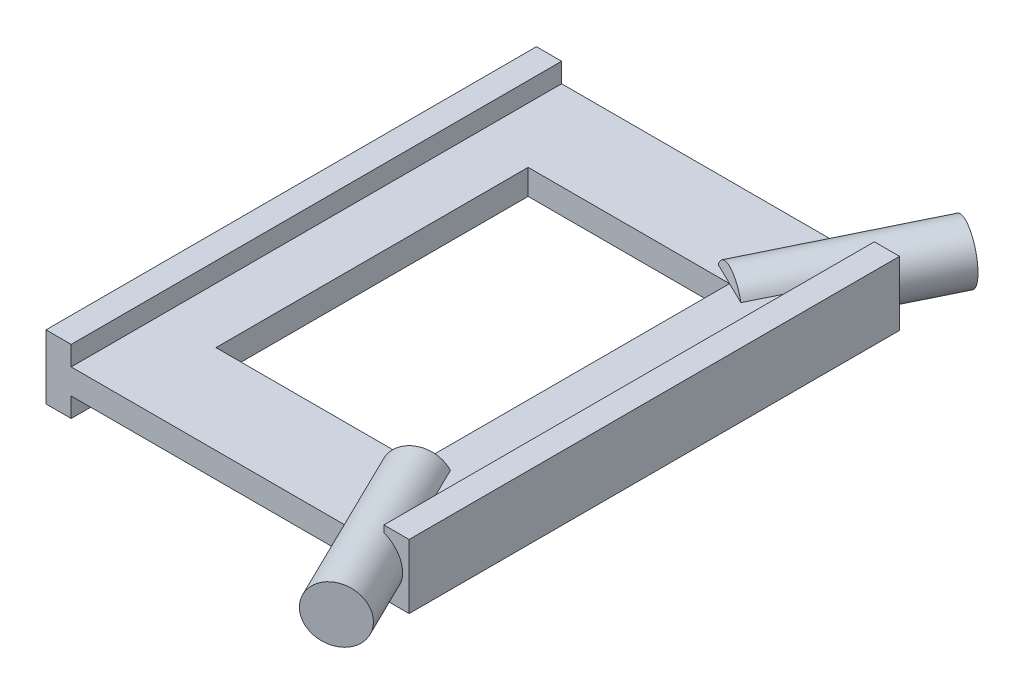
ISO-10303-21;
HEADER;
FILE_DESCRIPTION(('STEP AP214'),'2;1');
FILE_NAME('part.step','',(''),(''),'','','');
FILE_SCHEMA(('AUTOMOTIVE_DESIGN { 1 0 10303 214 1 1 1 1 }'));
ENDSEC;
DATA;
#1=APPLICATION_CONTEXT('core data for automotive mechanical design processes');
#2=APPLICATION_PROTOCOL_DEFINITION('international standard','automotive_design',2000,#1);
#3=PRODUCT_CONTEXT('',#1,'mechanical');
#4=PRODUCT('Part','Part','',(#3));
#5=PRODUCT_RELATED_PRODUCT_CATEGORY('part','',(#4));
#6=PRODUCT_DEFINITION_FORMATION('','',#4);
#7=PRODUCT_DEFINITION_CONTEXT('part definition',#1,'design');
#8=PRODUCT_DEFINITION('design','',#6,#7);
#9=PRODUCT_DEFINITION_SHAPE('','',#8);
#10=(LENGTH_UNIT() NAMED_UNIT(*) SI_UNIT(.MILLI.,.METRE.));
#11=(NAMED_UNIT(*) PLANE_ANGLE_UNIT() SI_UNIT($,.RADIAN.));
#12=(NAMED_UNIT(*) SI_UNIT($,.STERADIAN.) SOLID_ANGLE_UNIT());
#13=UNCERTAINTY_MEASURE_WITH_UNIT(LENGTH_MEASURE(1.E-05),#10,'distance_accuracy_value','');
#14=(GEOMETRIC_REPRESENTATION_CONTEXT(3) GLOBAL_UNCERTAINTY_ASSIGNED_CONTEXT((#13)) GLOBAL_UNIT_ASSIGNED_CONTEXT((#10,
#11,#12)) REPRESENTATION_CONTEXT('',''));
#15=CARTESIAN_POINT('',(0.,0.,0.));
#16=DIRECTION('',(0.,0.,1.));
#17=DIRECTION('',(1.,0.,0.));
#18=AXIS2_PLACEMENT_3D('',#15,#16,#17);
#19=CARTESIAN_POINT('',(0.,2.5,0.));
#20=DIRECTION('',(0.,-1.,0.));
#21=DIRECTION('',(0.,0.,-1.));
#22=AXIS2_PLACEMENT_3D('',#19,#20,#21);
#23=PLANE('',#22);
#24=DIRECTION('',(-0.439040686185192,0.,-0.898467181300484));
#25=VECTOR('',#24,1.);
#26=CARTESIAN_POINT('',(15.5984277103543,2.5,33.1508513149502));
#27=LINE('',#26,#25);
#28=CARTESIAN_POINT('',(15.5984277103543,2.5,33.1508513149502));
#29=VERTEX_POINT('',#28);
#30=CARTESIAN_POINT('',(23.1966005210723,2.5,48.7));
#31=VERTEX_POINT('',#30);
#32=EDGE_CURVE('E47',#29,#31,#27,.F.);
#33=ORIENTED_EDGE('',*,*,#32,.F.);
#34=DIRECTION('',(-0.898467181300484,0.,0.439040686185192));
#35=VECTOR('',#34,1.);
#36=CARTESIAN_POINT('',(16.0835075641035,2.5,32.9138145079559));
#37=LINE('',#36,#35);
#38=CARTESIAN_POINT('',(20.,2.5,31.));
#39=VERTEX_POINT('',#38);
#40=EDGE_CURVE('E222',#39,#29,#37,.T.);
#41=ORIENTED_EDGE('',*,*,#40,.F.);
#42=DIRECTION('',(-1.,0.,0.));
#43=VECTOR('',#42,1.);
#44=CARTESIAN_POINT('',(0.,2.5,31.));
#45=LINE('',#44,#43);
#46=CARTESIAN_POINT('',(-20.,2.5,31.));
#47=VERTEX_POINT('',#46);
#48=EDGE_CURVE('E283',#39,#47,#45,.T.);
#49=ORIENTED_EDGE('',*,*,#48,.T.);
#50=DIRECTION('',(0.,0.,-1.));
#51=VECTOR('',#50,1.);
#52=CARTESIAN_POINT('',(-20.,2.5,0.));
#53=LINE('',#52,#51);
#54=CARTESIAN_POINT('',(-20.,2.5,-31.));
#55=VERTEX_POINT('',#54);
#56=EDGE_CURVE('E280',#47,#55,#53,.T.);
#57=ORIENTED_EDGE('',*,*,#56,.T.);
#58=DIRECTION('',(1.,0.,0.));
#59=VECTOR('',#58,1.);
#60=CARTESIAN_POINT('',(0.,2.5,-31.));
#61=LINE('',#60,#59);
#62=CARTESIAN_POINT('',(20.,2.5,-31.));
#63=VERTEX_POINT('',#62);
#64=EDGE_CURVE('E269',#55,#63,#61,.T.);
#65=ORIENTED_EDGE('',*,*,#64,.T.);
#66=DIRECTION('',(0.898467181300484,0.,0.439040686185192));
#67=VECTOR('',#66,1.);
#68=CARTESIAN_POINT('',(16.0835075641035,2.5,-32.9138145079559));
#69=LINE('',#68,#67);
#70=CARTESIAN_POINT('',(15.5984277103543,2.5,-33.1508513149502));
#71=VERTEX_POINT('',#70);
#72=EDGE_CURVE('E248',#71,#63,#69,.T.);
#73=ORIENTED_EDGE('',*,*,#72,.F.);
#74=DIRECTION('',(-0.439040686185192,0.,0.898467181300484));
#75=VECTOR('',#74,1.);
#76=CARTESIAN_POINT('',(15.5984277103543,2.5,-33.1508513149502));
#77=LINE('',#76,#75);
#78=CARTESIAN_POINT('',(23.1966005210723,2.5,-48.7));
#79=VERTEX_POINT('',#78);
#80=EDGE_CURVE('E262',#79,#71,#77,.T.);
#81=ORIENTED_EDGE('',*,*,#80,.F.);
#82=DIRECTION('',(-1.,0.,0.));
#83=VECTOR('',#82,1.);
#84=CARTESIAN_POINT('',(-36.055,2.5,-48.7));
#85=LINE('',#84,#83);
#86=CARTESIAN_POINT('',(-31.055,2.5,-48.7));
#87=VERTEX_POINT('',#86);
#88=EDGE_CURVE('E350',#79,#87,#85,.T.);
#89=ORIENTED_EDGE('',*,*,#88,.T.);
#90=DIRECTION('',(0.,0.,-1.));
#91=VECTOR('',#90,1.);
#92=CARTESIAN_POINT('',(-31.055,2.5,0.));
#93=LINE('',#92,#91);
#94=CARTESIAN_POINT('',(-31.055,2.5,48.7));
#95=VERTEX_POINT('',#94);
#96=EDGE_CURVE('E346',#95,#87,#93,.T.);
#97=ORIENTED_EDGE('',*,*,#96,.F.);
#98=DIRECTION('',(1.,0.,0.));
#99=VECTOR('',#98,1.);
#100=CARTESIAN_POINT('',(-36.055,2.5,48.7));
#101=LINE('',#100,#99);
#102=EDGE_CURVE('E352',#95,#31,#101,.T.);
#103=ORIENTED_EDGE('',*,*,#102,.T.);
#104=EDGE_LOOP('',(#33,#41,#49,#57,#65,#73,#81,#89,#97,#103));
#105=FACE_BOUND('',#104,.T.);
#106=ADVANCED_FACE('F32',(#105),#23,.F.);
#107=CARTESIAN_POINT('',(24.4015722896457,2.5,28.8491486850498));
#108=VERTEX_POINT('',#107);
#109=EDGE_CURVE('E55',#108,#39,#37,.T.);
#110=ORIENTED_EDGE('',*,*,#109,.F.);
#111=DIRECTION('',(-0.439040686185192,0.,-0.898467181300484));
#112=VECTOR('',#111,1.);
#113=CARTESIAN_POINT('',(24.4015722896457,2.5,28.8491486850498));
#114=LINE('',#113,#112);
#115=CARTESIAN_POINT('',(31.055,2.5,42.4649401800253));
#116=VERTEX_POINT('',#115);
#117=EDGE_CURVE('E204',#116,#108,#114,.T.);
#118=ORIENTED_EDGE('',*,*,#117,.F.);
#119=DIRECTION('',(0.,0.,1.));
#120=VECTOR('',#119,1.);
#121=CARTESIAN_POINT('',(31.055,2.5,0.));
#122=LINE('',#121,#120);
#123=CARTESIAN_POINT('',(31.055,2.5,-42.4649401800253));
#124=VERTEX_POINT('',#123);
#125=EDGE_CURVE('E195',#124,#116,#122,.T.);
#126=ORIENTED_EDGE('',*,*,#125,.F.);
#127=DIRECTION('',(-0.439040686185192,0.,0.898467181300484));
#128=VECTOR('',#127,1.);
#129=CARTESIAN_POINT('',(24.4015722896457,2.5,-28.8491486850498));
#130=LINE('',#129,#128);
#131=CARTESIAN_POINT('',(24.4015722896457,2.5,-28.8491486850498));
#132=VERTEX_POINT('',#131);
#133=EDGE_CURVE('E252',#132,#124,#130,.F.);
#134=ORIENTED_EDGE('',*,*,#133,.F.);
#135=EDGE_CURVE('E244',#63,#132,#69,.T.);
#136=ORIENTED_EDGE('',*,*,#135,.F.);
#137=DIRECTION('',(0.,0.,1.));
#138=VECTOR('',#137,1.);
#139=CARTESIAN_POINT('',(20.,2.5,0.));
#140=LINE('',#139,#138);
#141=EDGE_CURVE('E286',#63,#39,#140,.T.);
#142=ORIENTED_EDGE('',*,*,#141,.T.);
#143=EDGE_LOOP('',(#110,#118,#126,#134,#136,#142));
#144=FACE_BOUND('',#143,.T.);
#145=ADVANCED_FACE('F205',(#144),#23,.F.);
#146=CARTESIAN_POINT('',(0.,-2.5,0.));
#147=DIRECTION('',(0.,-1.,0.));
#148=DIRECTION('',(0.,0.,-1.));
#149=AXIS2_PLACEMENT_3D('',#146,#147,#148);
#150=PLANE('',#149);
#151=DIRECTION('',(-0.898467181300484,0.,0.439040686185192));
#152=VECTOR('',#151,1.);
#153=CARTESIAN_POINT('',(16.0835075641035,-2.5,32.9138145079559));
#154=LINE('',#153,#152);
#155=CARTESIAN_POINT('',(20.,-2.5,31.));
#156=VERTEX_POINT('',#155);
#157=CARTESIAN_POINT('',(15.5984277103543,-2.5,33.1508513149502));
#158=VERTEX_POINT('',#157);
#159=EDGE_CURVE('E481',#156,#158,#154,.T.);
#160=ORIENTED_EDGE('',*,*,#159,.T.);
#161=DIRECTION('',(-0.439040686185192,0.,-0.898467181300484));
#162=VECTOR('',#161,1.);
#163=CARTESIAN_POINT('',(15.5984277103543,-2.5,33.1508513149502));
#164=LINE('',#163,#162);
#165=CARTESIAN_POINT('',(23.1966005210723,-2.5,48.7));
#166=VERTEX_POINT('',#165);
#167=EDGE_CURVE('E224',#158,#166,#164,.F.);
#168=ORIENTED_EDGE('',*,*,#167,.T.);
#169=DIRECTION('',(1.,0.,0.));
#170=VECTOR('',#169,1.);
#171=CARTESIAN_POINT('',(-36.055,-2.5,48.7));
#172=LINE('',#171,#170);
#173=CARTESIAN_POINT('',(-31.055,-2.5,48.7));
#174=VERTEX_POINT('',#173);
#175=EDGE_CURVE('E353',#174,#166,#172,.T.);
#176=ORIENTED_EDGE('',*,*,#175,.F.);
#177=DIRECTION('',(0.,0.,-1.));
#178=VECTOR('',#177,1.);
#179=CARTESIAN_POINT('',(-31.055,-2.5,0.));
#180=LINE('',#179,#178);
#181=CARTESIAN_POINT('',(-31.055,-2.5,-48.7));
#182=VERTEX_POINT('',#181);
#183=EDGE_CURVE('E366',#174,#182,#180,.T.);
#184=ORIENTED_EDGE('',*,*,#183,.T.);
#185=DIRECTION('',(-1.,0.,0.));
#186=VECTOR('',#185,1.);
#187=CARTESIAN_POINT('',(-36.055,-2.5,-48.7));
#188=LINE('',#187,#186);
#189=CARTESIAN_POINT('',(23.1966005210723,-2.5,-48.7));
#190=VERTEX_POINT('',#189);
#191=EDGE_CURVE('E349',#190,#182,#188,.T.);
#192=ORIENTED_EDGE('',*,*,#191,.F.);
#193=DIRECTION('',(-0.439040686185192,0.,0.898467181300484));
#194=VECTOR('',#193,1.);
#195=CARTESIAN_POINT('',(15.5984277103543,-2.5,-33.1508513149502));
#196=LINE('',#195,#194);
#197=CARTESIAN_POINT('',(15.5984277103543,-2.5,-33.1508513149502));
#198=VERTEX_POINT('',#197);
#199=EDGE_CURVE('E260',#190,#198,#196,.T.);
#200=ORIENTED_EDGE('',*,*,#199,.T.);
#201=DIRECTION('',(0.898467181300484,0.,0.439040686185192));
#202=VECTOR('',#201,1.);
#203=CARTESIAN_POINT('',(16.0835075641035,-2.5,-32.9138145079559));
#204=LINE('',#203,#202);
#205=CARTESIAN_POINT('',(20.,-2.5,-31.));
#206=VERTEX_POINT('',#205);
#207=EDGE_CURVE('E245',#198,#206,#204,.T.);
#208=ORIENTED_EDGE('',*,*,#207,.T.);
#209=DIRECTION('',(1.,0.,0.));
#210=VECTOR('',#209,1.);
#211=CARTESIAN_POINT('',(0.,-2.5,-31.));
#212=LINE('',#211,#210);
#213=CARTESIAN_POINT('',(-20.,-2.5,-31.));
#214=VERTEX_POINT('',#213);
#215=EDGE_CURVE('E369',#214,#206,#212,.T.);
#216=ORIENTED_EDGE('',*,*,#215,.F.);
#217=DIRECTION('',(0.,0.,-1.));
#218=VECTOR('',#217,1.);
#219=CARTESIAN_POINT('',(-20.,-2.5,0.));
#220=LINE('',#219,#218);
#221=CARTESIAN_POINT('',(-20.,-2.5,31.));
#222=VERTEX_POINT('',#221);
#223=EDGE_CURVE('E372',#222,#214,#220,.T.);
#224=ORIENTED_EDGE('',*,*,#223,.F.);
#225=DIRECTION('',(-1.,0.,0.));
#226=VECTOR('',#225,1.);
#227=CARTESIAN_POINT('',(0.,-2.5,31.));
#228=LINE('',#227,#226);
#229=EDGE_CURVE('E375',#156,#222,#228,.T.);
#230=ORIENTED_EDGE('',*,*,#229,.F.);
#231=EDGE_LOOP('',(#160,#168,#176,#184,#192,#200,#208,#216,#224,#230));
#232=FACE_BOUND('',#231,.T.);
#233=ADVANCED_FACE('F390',(#232),#150,.T.);
#234=DIRECTION('',(-0.439040686185192,0.,-0.898467181300484));
#235=VECTOR('',#234,1.);
#236=CARTESIAN_POINT('',(24.4015722896457,-2.5,28.8491486850498));
#237=LINE('',#236,#235);
#238=CARTESIAN_POINT('',(31.055,-2.5,42.4649401800253));
#239=VERTEX_POINT('',#238);
#240=CARTESIAN_POINT('',(24.4015722896457,-2.5,28.8491486850498));
#241=VERTEX_POINT('',#240);
#242=EDGE_CURVE('E225',#239,#241,#237,.T.);
#243=ORIENTED_EDGE('',*,*,#242,.T.);
#244=EDGE_CURVE('E220',#241,#156,#154,.T.);
#245=ORIENTED_EDGE('',*,*,#244,.T.);
#246=DIRECTION('',(0.,0.,1.));
#247=VECTOR('',#246,1.);
#248=CARTESIAN_POINT('',(20.,-2.5,0.));
#249=LINE('',#248,#247);
#250=EDGE_CURVE('E377',#206,#156,#249,.T.);
#251=ORIENTED_EDGE('',*,*,#250,.F.);
#252=CARTESIAN_POINT('',(24.4015722896457,-2.5,-28.8491486850498));
#253=VERTEX_POINT('',#252);
#254=EDGE_CURVE('E242',#206,#253,#204,.T.);
#255=ORIENTED_EDGE('',*,*,#254,.T.);
#256=DIRECTION('',(-0.439040686185192,0.,0.898467181300484));
#257=VECTOR('',#256,1.);
#258=CARTESIAN_POINT('',(24.4015722896457,-2.5,-28.8491486850498));
#259=LINE('',#258,#257);
#260=CARTESIAN_POINT('',(31.055,-2.5,-42.4649401800253));
#261=VERTEX_POINT('',#260);
#262=EDGE_CURVE('E258',#253,#261,#259,.F.);
#263=ORIENTED_EDGE('',*,*,#262,.T.);
#264=DIRECTION('',(0.,0.,1.));
#265=VECTOR('',#264,1.);
#266=CARTESIAN_POINT('',(31.055,-2.5,0.));
#267=LINE('',#266,#265);
#268=EDGE_CURVE('E202',#261,#239,#267,.T.);
#269=ORIENTED_EDGE('',*,*,#268,.T.);
#270=EDGE_LOOP('',(#243,#245,#251,#255,#263,#269));
#271=FACE_BOUND('',#270,.T.);
#272=ADVANCED_FACE('F406',(#271),#150,.T.);
#273=CARTESIAN_POINT('',(-36.055,2.5,48.7));
#274=DIRECTION('',(0.,0.,-1.));
#275=DIRECTION('',(-1.,0.,0.));
#276=AXIS2_PLACEMENT_3D('',#273,#274,#275);
#277=PLANE('',#276);
#278=CARTESIAN_POINT('',(28.649197552469,0.,48.7));
#279=DIRECTION('',(0.,0.,-1.));
#280=DIRECTION('',(-1.,0.,0.));
#281=AXIS2_PLACEMENT_3D('',#278,#279,#280);
#282=ELLIPSE('',#281,6.12153689580408,5.50000000000001);
#283=CARTESIAN_POINT('',(31.055,-5.05744682779402,48.7));
#284=VERTEX_POINT('',#283);
#285=CARTESIAN_POINT('',(31.055,5.05744682779403,48.7));
#286=VERTEX_POINT('',#285);
#287=EDGE_CURVE('E210',#284,#286,#282,.F.);
#288=ORIENTED_EDGE('',*,*,#287,.F.);
#289=DIRECTION('',(0.,-1.,0.));
#290=VECTOR('',#289,1.);
#291=CARTESIAN_POINT('',(31.055,6.375,48.7));
#292=LINE('',#291,#290);
#293=CARTESIAN_POINT('',(31.055,-6.375,48.7));
#294=VERTEX_POINT('',#293);
#295=EDGE_CURVE('E300',#284,#294,#292,.T.);
#296=ORIENTED_EDGE('',*,*,#295,.T.);
#297=DIRECTION('',(1.,0.,0.));
#298=VECTOR('',#297,1.);
#299=CARTESIAN_POINT('',(36.055,-6.375,48.7));
#300=LINE('',#299,#298);
#301=CARTESIAN_POINT('',(36.055,-6.375,48.7));
#302=VERTEX_POINT('',#301);
#303=EDGE_CURVE('E293',#294,#302,#300,.T.);
#304=ORIENTED_EDGE('',*,*,#303,.T.);
#305=DIRECTION('',(0.,-1.,0.));
#306=VECTOR('',#305,1.);
#307=CARTESIAN_POINT('',(36.055,2.5,48.7));
#308=LINE('',#307,#306);
#309=CARTESIAN_POINT('',(36.055,6.375,48.7));
#310=VERTEX_POINT('',#309);
#311=EDGE_CURVE('E355',#310,#302,#308,.T.);
#312=ORIENTED_EDGE('',*,*,#311,.F.);
#313=DIRECTION('',(1.,0.,0.));
#314=VECTOR('',#313,1.);
#315=CARTESIAN_POINT('',(36.055,6.375,48.7));
#316=LINE('',#315,#314);
#317=CARTESIAN_POINT('',(31.055,6.375,48.7));
#318=VERTEX_POINT('',#317);
#319=EDGE_CURVE('E297',#318,#310,#316,.T.);
#320=ORIENTED_EDGE('',*,*,#319,.F.);
#321=EDGE_CURVE('E311',#318,#286,#292,.T.);
#322=ORIENTED_EDGE('',*,*,#321,.T.);
#323=EDGE_LOOP('',(#288,#296,#304,#312,#320,#322));
#324=FACE_BOUND('',#323,.T.);
#325=ADVANCED_FACE('F415',(#324),#277,.F.);
#326=CARTESIAN_POINT('',(-36.055,2.5,-48.7));
#327=DIRECTION('',(0.,0.,1.));
#328=DIRECTION('',(1.,0.,0.));
#329=AXIS2_PLACEMENT_3D('',#326,#327,#328);
#330=PLANE('',#329);
#331=CARTESIAN_POINT('',(28.649197552469,0.,-48.7));
#332=DIRECTION('',(0.,0.,1.));
#333=DIRECTION('',(-1.,0.,0.));
#334=AXIS2_PLACEMENT_3D('',#331,#332,#333);
#335=ELLIPSE('',#334,6.12153689580408,5.50000000000001);
#336=CARTESIAN_POINT('',(31.055,5.05744682779403,-48.7));
#337=VERTEX_POINT('',#336);
#338=CARTESIAN_POINT('',(31.055,-5.05744682779403,-48.7));
#339=VERTEX_POINT('',#338);
#340=EDGE_CURVE('E249',#337,#339,#335,.F.);
#341=ORIENTED_EDGE('',*,*,#340,.F.);
#342=DIRECTION('',(0.,-1.,0.));
#343=VECTOR('',#342,1.);
#344=CARTESIAN_POINT('',(31.055,6.375,-48.7));
#345=LINE('',#344,#343);
#346=CARTESIAN_POINT('',(31.055,6.375,-48.7));
#347=VERTEX_POINT('',#346);
#348=EDGE_CURVE('E314',#347,#337,#345,.T.);
#349=ORIENTED_EDGE('',*,*,#348,.F.);
#350=DIRECTION('',(-1.,0.,0.));
#351=VECTOR('',#350,1.);
#352=CARTESIAN_POINT('',(36.055,6.375,-48.7));
#353=LINE('',#352,#351);
#354=CARTESIAN_POINT('',(36.055,6.375,-48.7));
#355=VERTEX_POINT('',#354);
#356=EDGE_CURVE('E292',#355,#347,#353,.T.);
#357=ORIENTED_EDGE('',*,*,#356,.F.);
#358=DIRECTION('',(0.,-1.,0.));
#359=VECTOR('',#358,1.);
#360=CARTESIAN_POINT('',(36.055,2.5,-48.7));
#361=LINE('',#360,#359);
#362=CARTESIAN_POINT('',(36.055,-6.375,-48.7));
#363=VERTEX_POINT('',#362);
#364=EDGE_CURVE('E364',#355,#363,#361,.T.);
#365=ORIENTED_EDGE('',*,*,#364,.T.);
#366=DIRECTION('',(-1.,0.,0.));
#367=VECTOR('',#366,1.);
#368=CARTESIAN_POINT('',(36.055,-6.375,-48.7));
#369=LINE('',#368,#367);
#370=CARTESIAN_POINT('',(31.055,-6.375,-48.7));
#371=VERTEX_POINT('',#370);
#372=EDGE_CURVE('E303',#363,#371,#369,.T.);
#373=ORIENTED_EDGE('',*,*,#372,.T.);
#374=EDGE_CURVE('E313',#339,#371,#345,.T.);
#375=ORIENTED_EDGE('',*,*,#374,.F.);
#376=EDGE_LOOP('',(#341,#349,#357,#365,#373,#375));
#377=FACE_BOUND('',#376,.T.);
#378=ADVANCED_FACE('F429',(#377),#330,.F.);
#379=CARTESIAN_POINT('',(36.055,2.5,48.7));
#380=DIRECTION('',(-1.,0.,0.));
#381=DIRECTION('',(0.,0.,1.));
#382=AXIS2_PLACEMENT_3D('',#379,#380,#381);
#383=PLANE('',#382);
#384=ORIENTED_EDGE('',*,*,#311,.T.);
#385=DIRECTION('',(0.,0.,-1.));
#386=VECTOR('',#385,1.);
#387=CARTESIAN_POINT('',(36.055,-6.375,-48.7));
#388=LINE('',#387,#386);
#389=EDGE_CURVE('E288',#302,#363,#388,.T.);
#390=ORIENTED_EDGE('',*,*,#389,.T.);
#391=ORIENTED_EDGE('',*,*,#364,.F.);
#392=DIRECTION('',(0.,0.,-1.));
#393=VECTOR('',#392,1.);
#394=CARTESIAN_POINT('',(36.055,6.375,-48.7));
#395=LINE('',#394,#393);
#396=EDGE_CURVE('E289',#310,#355,#395,.T.);
#397=ORIENTED_EDGE('',*,*,#396,.F.);
#398=EDGE_LOOP('',(#384,#390,#391,#397));
#399=FACE_BOUND('',#398,.T.);
#400=ADVANCED_FACE('F34',(#399),#383,.F.);
#401=EDGE_CURVE('E253',#190,#79,#335,.F.);
#402=ORIENTED_EDGE('',*,*,#401,.F.);
#403=ORIENTED_EDGE('',*,*,#191,.T.);
#404=DIRECTION('',(0.,-1.,0.));
#405=VECTOR('',#404,1.);
#406=CARTESIAN_POINT('',(-31.055,6.375,-48.7));
#407=LINE('',#406,#405);
#408=CARTESIAN_POINT('',(-31.055,-6.375,-48.7));
#409=VERTEX_POINT('',#408);
#410=EDGE_CURVE('E328',#182,#409,#407,.T.);
#411=ORIENTED_EDGE('',*,*,#410,.T.);
#412=DIRECTION('',(-1.,0.,0.));
#413=VECTOR('',#412,1.);
#414=CARTESIAN_POINT('',(-36.055,-6.375,-48.7));
#415=LINE('',#414,#413);
#416=CARTESIAN_POINT('',(-36.055,-6.375,-48.7));
#417=VERTEX_POINT('',#416);
#418=EDGE_CURVE('E321',#409,#417,#415,.T.);
#419=ORIENTED_EDGE('',*,*,#418,.T.);
#420=DIRECTION('',(0.,-1.,0.));
#421=VECTOR('',#420,1.);
#422=CARTESIAN_POINT('',(-36.055,2.5,-48.7));
#423=LINE('',#422,#421);
#424=CARTESIAN_POINT('',(-36.055,6.375,-48.7));
#425=VERTEX_POINT('',#424);
#426=EDGE_CURVE('E362',#425,#417,#423,.T.);
#427=ORIENTED_EDGE('',*,*,#426,.F.);
#428=DIRECTION('',(-1.,0.,0.));
#429=VECTOR('',#428,1.);
#430=CARTESIAN_POINT('',(-36.055,6.375,-48.7));
#431=LINE('',#430,#429);
#432=CARTESIAN_POINT('',(-31.055,6.375,-48.7));
#433=VERTEX_POINT('',#432);
#434=EDGE_CURVE('E325',#433,#425,#431,.T.);
#435=ORIENTED_EDGE('',*,*,#434,.F.);
#436=EDGE_CURVE('E339',#433,#87,#407,.T.);
#437=ORIENTED_EDGE('',*,*,#436,.T.);
#438=ORIENTED_EDGE('',*,*,#88,.F.);
#439=EDGE_LOOP('',(#402,#403,#411,#419,#427,#435,#437,#438));
#440=FACE_BOUND('',#439,.T.);
#441=ADVANCED_FACE('F431',(#440),#330,.F.);
#442=CARTESIAN_POINT('',(-36.055,2.5,48.7));
#443=DIRECTION('',(1.,0.,0.));
#444=DIRECTION('',(0.,0.,-1.));
#445=AXIS2_PLACEMENT_3D('',#442,#443,#444);
#446=PLANE('',#445);
#447=ORIENTED_EDGE('',*,*,#426,.T.);
#448=DIRECTION('',(0.,0.,1.));
#449=VECTOR('',#448,1.);
#450=CARTESIAN_POINT('',(-36.055,-6.375,-48.7));
#451=LINE('',#450,#449);
#452=CARTESIAN_POINT('',(-36.055,-6.375,48.7));
#453=VERTEX_POINT('',#452);
#454=EDGE_CURVE('E201',#417,#453,#451,.T.);
#455=ORIENTED_EDGE('',*,*,#454,.T.);
#456=DIRECTION('',(0.,-1.,0.));
#457=VECTOR('',#456,1.);
#458=CARTESIAN_POINT('',(-36.055,2.5,48.7));
#459=LINE('',#458,#457);
#460=CARTESIAN_POINT('',(-36.055,6.375,48.7));
#461=VERTEX_POINT('',#460);
#462=EDGE_CURVE('E360',#461,#453,#459,.T.);
#463=ORIENTED_EDGE('',*,*,#462,.F.);
#464=DIRECTION('',(0.,0.,1.));
#465=VECTOR('',#464,1.);
#466=CARTESIAN_POINT('',(-36.055,6.375,-48.7));
#467=LINE('',#466,#465);
#468=EDGE_CURVE('E317',#425,#461,#467,.T.);
#469=ORIENTED_EDGE('',*,*,#468,.F.);
#470=EDGE_LOOP('',(#447,#455,#463,#469));
#471=FACE_BOUND('',#470,.T.);
#472=ADVANCED_FACE('F440',(#471),#446,.F.);
#473=EDGE_CURVE('E219',#31,#166,#282,.F.);
#474=ORIENTED_EDGE('',*,*,#473,.F.);
#475=ORIENTED_EDGE('',*,*,#102,.F.);
#476=DIRECTION('',(0.,-1.,0.));
#477=VECTOR('',#476,1.);
#478=CARTESIAN_POINT('',(-31.055,6.375,48.7));
#479=LINE('',#478,#477);
#480=CARTESIAN_POINT('',(-31.055,6.375,48.7));
#481=VERTEX_POINT('',#480);
#482=EDGE_CURVE('E343',#481,#95,#479,.T.);
#483=ORIENTED_EDGE('',*,*,#482,.F.);
#484=DIRECTION('',(1.,0.,0.));
#485=VECTOR('',#484,1.);
#486=CARTESIAN_POINT('',(-36.055,6.375,48.7));
#487=LINE('',#486,#485);
#488=EDGE_CURVE('E320',#461,#481,#487,.T.);
#489=ORIENTED_EDGE('',*,*,#488,.F.);
#490=ORIENTED_EDGE('',*,*,#462,.T.);
#491=DIRECTION('',(1.,0.,0.));
#492=VECTOR('',#491,1.);
#493=CARTESIAN_POINT('',(-36.055,-6.375,48.7));
#494=LINE('',#493,#492);
#495=CARTESIAN_POINT('',(-31.055,-6.375,48.7));
#496=VERTEX_POINT('',#495);
#497=EDGE_CURVE('E331',#453,#496,#494,.T.);
#498=ORIENTED_EDGE('',*,*,#497,.T.);
#499=EDGE_CURVE('E342',#174,#496,#479,.T.);
#500=ORIENTED_EDGE('',*,*,#499,.F.);
#501=ORIENTED_EDGE('',*,*,#175,.T.);
#502=EDGE_LOOP('',(#474,#475,#483,#489,#490,#498,#500,#501));
#503=FACE_BOUND('',#502,.T.);
#504=ADVANCED_FACE('F437',(#503),#277,.F.);
#505=CARTESIAN_POINT('',(0.,-6.375,0.));
#506=DIRECTION('',(0.,1.,0.));
#507=DIRECTION('',(0.,0.,1.));
#508=AXIS2_PLACEMENT_3D('',#505,#506,#507);
#509=PLANE('',#508);
#510=ORIENTED_EDGE('',*,*,#454,.F.);
#511=ORIENTED_EDGE('',*,*,#418,.F.);
#512=DIRECTION('',(0.,0.,-1.));
#513=VECTOR('',#512,1.);
#514=CARTESIAN_POINT('',(-31.055,-6.375,-48.7));
#515=LINE('',#514,#513);
#516=EDGE_CURVE('E334',#496,#409,#515,.T.);
#517=ORIENTED_EDGE('',*,*,#516,.F.);
#518=ORIENTED_EDGE('',*,*,#497,.F.);
#519=EDGE_LOOP('',(#510,#511,#517,#518));
#520=FACE_BOUND('',#519,.T.);
#521=ADVANCED_FACE('F453',(#520),#509,.F.);
#522=CARTESIAN_POINT('',(-31.055,6.375,-48.7));
#523=DIRECTION('',(-1.,0.,0.));
#524=DIRECTION('',(0.,0.,1.));
#525=AXIS2_PLACEMENT_3D('',#522,#523,#524);
#526=PLANE('',#525);
#527=ORIENTED_EDGE('',*,*,#183,.F.);
#528=ORIENTED_EDGE('',*,*,#499,.T.);
#529=ORIENTED_EDGE('',*,*,#516,.T.);
#530=ORIENTED_EDGE('',*,*,#410,.F.);
#531=EDGE_LOOP('',(#527,#528,#529,#530));
#532=FACE_BOUND('',#531,.T.);
#533=ADVANCED_FACE('F449',(#532),#526,.F.);
#534=ORIENTED_EDGE('',*,*,#482,.T.);
#535=ORIENTED_EDGE('',*,*,#96,.T.);
#536=ORIENTED_EDGE('',*,*,#436,.F.);
#537=DIRECTION('',(0.,0.,-1.));
#538=VECTOR('',#537,1.);
#539=CARTESIAN_POINT('',(-31.055,6.375,-48.7));
#540=LINE('',#539,#538);
#541=EDGE_CURVE('E323',#481,#433,#540,.T.);
#542=ORIENTED_EDGE('',*,*,#541,.F.);
#543=EDGE_LOOP('',(#534,#535,#536,#542));
#544=FACE_BOUND('',#543,.T.);
#545=ADVANCED_FACE('F478',(#544),#526,.F.);
#546=CARTESIAN_POINT('',(0.,6.375,0.));
#547=DIRECTION('',(0.,1.,0.));
#548=DIRECTION('',(0.,0.,1.));
#549=AXIS2_PLACEMENT_3D('',#546,#547,#548);
#550=PLANE('',#549);
#551=ORIENTED_EDGE('',*,*,#468,.T.);
#552=ORIENTED_EDGE('',*,*,#488,.T.);
#553=ORIENTED_EDGE('',*,*,#541,.T.);
#554=ORIENTED_EDGE('',*,*,#434,.T.);
#555=EDGE_LOOP('',(#551,#552,#553,#554));
#556=FACE_BOUND('',#555,.T.);
#557=ADVANCED_FACE('F474',(#556),#550,.T.);
#558=CARTESIAN_POINT('',(0.,-6.375,0.));
#559=DIRECTION('',(0.,-1.,0.));
#560=DIRECTION('',(0.,0.,-1.));
#561=AXIS2_PLACEMENT_3D('',#558,#559,#560);
#562=PLANE('',#561);
#563=ORIENTED_EDGE('',*,*,#389,.F.);
#564=ORIENTED_EDGE('',*,*,#303,.F.);
#565=DIRECTION('',(0.,0.,1.));
#566=VECTOR('',#565,1.);
#567=CARTESIAN_POINT('',(31.055,-6.375,-48.7));
#568=LINE('',#567,#566);
#569=EDGE_CURVE('E306',#371,#294,#568,.T.);
#570=ORIENTED_EDGE('',*,*,#569,.F.);
#571=ORIENTED_EDGE('',*,*,#372,.F.);
#572=EDGE_LOOP('',(#563,#564,#570,#571));
#573=FACE_BOUND('',#572,.T.);
#574=ADVANCED_FACE('F420',(#573),#562,.T.);
#575=CARTESIAN_POINT('',(31.055,6.375,-48.7));
#576=DIRECTION('',(1.,0.,0.));
#577=DIRECTION('',(0.,0.,-1.));
#578=AXIS2_PLACEMENT_3D('',#575,#576,#577);
#579=PLANE('',#578);
#580=CARTESIAN_POINT('',(31.055,0.,53.6233126036233));
#581=DIRECTION('',(1.,0.,0.));
#582=DIRECTION('',(0.,0.,-1.));
#583=AXIS2_PLACEMENT_3D('',#580,#581,#582);
#584=ELLIPSE('',#583,12.5273127823057,5.50000000000001);
#585=EDGE_CURVE('E209',#239,#284,#584,.F.);
#586=ORIENTED_EDGE('',*,*,#585,.F.);
#587=ORIENTED_EDGE('',*,*,#268,.F.);
#588=CARTESIAN_POINT('',(31.055,0.,-53.6233126036233));
#589=DIRECTION('',(1.,0.,0.));
#590=DIRECTION('',(0.,0.,1.));
#591=AXIS2_PLACEMENT_3D('',#588,#589,#590);
#592=ELLIPSE('',#591,12.5273127823057,5.50000000000001);
#593=EDGE_CURVE('E255',#339,#261,#592,.F.);
#594=ORIENTED_EDGE('',*,*,#593,.F.);
#595=ORIENTED_EDGE('',*,*,#374,.T.);
#596=ORIENTED_EDGE('',*,*,#569,.T.);
#597=ORIENTED_EDGE('',*,*,#295,.F.);
#598=EDGE_LOOP('',(#586,#587,#594,#595,#596,#597));
#599=FACE_BOUND('',#598,.T.);
#600=ADVANCED_FACE('F411',(#599),#579,.F.);
#601=CARTESIAN_POINT('',(31.055,0.,53.6233126036233));
#602=DIRECTION('',(1.,0.,0.));
#603=DIRECTION('',(0.,0.,-1.));
#604=AXIS2_PLACEMENT_3D('',#601,#602,#603);
#605=ELLIPSE('',#604,12.5273127823057,5.50000000000001);
#606=EDGE_CURVE('E11',#286,#116,#605,.F.);
#607=ORIENTED_EDGE('',*,*,#606,.F.);
#608=ORIENTED_EDGE('',*,*,#321,.F.);
#609=DIRECTION('',(0.,0.,1.));
#610=VECTOR('',#609,1.);
#611=CARTESIAN_POINT('',(31.055,6.375,-48.7));
#612=LINE('',#611,#610);
#613=EDGE_CURVE('E295',#347,#318,#612,.T.);
#614=ORIENTED_EDGE('',*,*,#613,.F.);
#615=ORIENTED_EDGE('',*,*,#348,.T.);
#616=CARTESIAN_POINT('',(31.055,0.,-53.6233126036233));
#617=DIRECTION('',(1.,0.,0.));
#618=DIRECTION('',(0.,0.,1.));
#619=AXIS2_PLACEMENT_3D('',#616,#617,#618);
#620=ELLIPSE('',#619,12.5273127823057,5.50000000000001);
#621=EDGE_CURVE('E40',#124,#337,#620,.F.);
#622=ORIENTED_EDGE('',*,*,#621,.F.);
#623=ORIENTED_EDGE('',*,*,#125,.T.);
#624=EDGE_LOOP('',(#607,#608,#614,#615,#622,#623));
#625=FACE_BOUND('',#624,.T.);
#626=ADVANCED_FACE('F196',(#625),#579,.F.);
#627=CARTESIAN_POINT('',(0.,6.375,0.));
#628=DIRECTION('',(0.,-1.,0.));
#629=DIRECTION('',(0.,0.,-1.));
#630=AXIS2_PLACEMENT_3D('',#627,#628,#629);
#631=PLANE('',#630);
#632=ORIENTED_EDGE('',*,*,#396,.T.);
#633=ORIENTED_EDGE('',*,*,#356,.T.);
#634=ORIENTED_EDGE('',*,*,#613,.T.);
#635=ORIENTED_EDGE('',*,*,#319,.T.);
#636=EDGE_LOOP('',(#632,#633,#634,#635));
#637=FACE_BOUND('',#636,.T.);
#638=ADVANCED_FACE('F425',(#637),#631,.F.);
#639=CARTESIAN_POINT('',(20.,-6.375,31.));
#640=DIRECTION('',(1.,0.,0.));
#641=DIRECTION('',(0.,0.,-1.));
#642=AXIS2_PLACEMENT_3D('',#639,#640,#641);
#643=PLANE('',#642);
#644=DIRECTION('',(0.,1.,0.));
#645=VECTOR('',#644,1.);
#646=CARTESIAN_POINT('',(20.,-6.375,-31.));
#647=LINE('',#646,#645);
#648=EDGE_CURVE('E265',#206,#63,#647,.T.);
#649=ORIENTED_EDGE('',*,*,#648,.F.);
#650=ORIENTED_EDGE('',*,*,#250,.T.);
#651=DIRECTION('',(0.,1.,0.));
#652=VECTOR('',#651,1.);
#653=CARTESIAN_POINT('',(20.,-6.375,31.));
#654=LINE('',#653,#652);
#655=EDGE_CURVE('E266',#156,#39,#654,.T.);
#656=ORIENTED_EDGE('',*,*,#655,.T.);
#657=ORIENTED_EDGE('',*,*,#141,.F.);
#658=EDGE_LOOP('',(#649,#650,#656,#657));
#659=FACE_BOUND('',#658,.T.);
#660=ADVANCED_FACE('F404',(#659),#643,.F.);
#661=CARTESIAN_POINT('',(-20.,-6.375,31.));
#662=DIRECTION('',(0.,0.,1.));
#663=DIRECTION('',(1.,0.,0.));
#664=AXIS2_PLACEMENT_3D('',#661,#662,#663);
#665=PLANE('',#664);
#666=ORIENTED_EDGE('',*,*,#655,.F.);
#667=ORIENTED_EDGE('',*,*,#229,.T.);
#668=DIRECTION('',(0.,1.,0.));
#669=VECTOR('',#668,1.);
#670=CARTESIAN_POINT('',(-20.,-6.375,31.));
#671=LINE('',#670,#669);
#672=EDGE_CURVE('E270',#222,#47,#671,.T.);
#673=ORIENTED_EDGE('',*,*,#672,.T.);
#674=ORIENTED_EDGE('',*,*,#48,.F.);
#675=EDGE_LOOP('',(#666,#667,#673,#674));
#676=FACE_BOUND('',#675,.T.);
#677=ADVANCED_FACE('F497',(#676),#665,.F.);
#678=CARTESIAN_POINT('',(-20.,-6.375,31.));
#679=DIRECTION('',(-1.,0.,0.));
#680=DIRECTION('',(0.,0.,1.));
#681=AXIS2_PLACEMENT_3D('',#678,#679,#680);
#682=PLANE('',#681);
#683=ORIENTED_EDGE('',*,*,#672,.F.);
#684=ORIENTED_EDGE('',*,*,#223,.T.);
#685=DIRECTION('',(0.,1.,0.));
#686=VECTOR('',#685,1.);
#687=CARTESIAN_POINT('',(-20.,-6.375,-31.));
#688=LINE('',#687,#686);
#689=EDGE_CURVE('E273',#214,#55,#688,.T.);
#690=ORIENTED_EDGE('',*,*,#689,.T.);
#691=ORIENTED_EDGE('',*,*,#56,.F.);
#692=EDGE_LOOP('',(#683,#684,#690,#691));
#693=FACE_BOUND('',#692,.T.);
#694=ADVANCED_FACE('F500',(#693),#682,.F.);
#695=CARTESIAN_POINT('',(-20.,-6.375,-31.));
#696=DIRECTION('',(0.,0.,-1.));
#697=DIRECTION('',(-1.,0.,0.));
#698=AXIS2_PLACEMENT_3D('',#695,#696,#697);
#699=PLANE('',#698);
#700=ORIENTED_EDGE('',*,*,#689,.F.);
#701=ORIENTED_EDGE('',*,*,#215,.T.);
#702=ORIENTED_EDGE('',*,*,#648,.T.);
#703=ORIENTED_EDGE('',*,*,#64,.F.);
#704=EDGE_LOOP('',(#700,#701,#702,#703));
#705=FACE_BOUND('',#704,.T.);
#706=ADVANCED_FACE('F400',(#705),#699,.F.);
#707=CARTESIAN_POINT('',(20.,0.,-31.));
#708=DIRECTION('',(-0.439040686185192,0.,0.898467181300484));
#709=DIRECTION('',(0.898467181300484,0.,0.439040686185192));
#710=AXIS2_PLACEMENT_3D('',#707,#708,#709);
#711=CYLINDRICAL_SURFACE('',#710,5.50000000000001);
#712=CARTESIAN_POINT('',(35.3664240164817,0.,-62.4463513455169));
#713=DIRECTION('',(-0.439040686185192,0.,0.898467181300484));
#714=DIRECTION('',(0.898467181300484,0.,0.439040686185192));
#715=AXIS2_PLACEMENT_3D('',#712,#713,#714);
#716=CIRCLE('',#715,5.50000000000001);
#717=CARTESIAN_POINT('',(40.3079935136344,0.,-60.0316275714984));
#718=VERTEX_POINT('',#717);
#719=EDGE_CURVE('E235',#718,#718,#716,.T.);
#720=ORIENTED_EDGE('',*,*,#719,.T.);
#721=EDGE_LOOP('',(#720));
#722=FACE_BOUND('',#721,.T.);
#723=ORIENTED_EDGE('',*,*,#401,.T.);
#724=ORIENTED_EDGE('',*,*,#80,.T.);
#725=CARTESIAN_POINT('',(20.,0.,-31.));
#726=DIRECTION('',(-0.439040686185192,0.,0.898467181300484));
#727=DIRECTION('',(0.898467181300484,0.,0.439040686185192));
#728=AXIS2_PLACEMENT_3D('',#725,#726,#727);
#729=CIRCLE('',#728,5.5);
#730=EDGE_CURVE('E239',#132,#71,#729,.T.);
#731=ORIENTED_EDGE('',*,*,#730,.F.);
#732=ORIENTED_EDGE('',*,*,#133,.T.);
#733=ORIENTED_EDGE('',*,*,#621,.T.);
#734=ORIENTED_EDGE('',*,*,#340,.T.);
#735=ORIENTED_EDGE('',*,*,#593,.T.);
#736=ORIENTED_EDGE('',*,*,#262,.F.);
#737=EDGE_CURVE('E238',#198,#253,#729,.T.);
#738=ORIENTED_EDGE('',*,*,#737,.F.);
#739=ORIENTED_EDGE('',*,*,#199,.F.);
#740=EDGE_LOOP('',(#723,#724,#731,#732,#733,#734,#735,#736,#738,#739));
#741=FACE_BOUND('',#740,.T.);
#742=ADVANCED_FACE('F381',(#722,#741),#711,.T.);
#743=CARTESIAN_POINT('',(20.,0.,-31.));
#744=DIRECTION('',(0.439040686185192,0.,-0.898467181300484));
#745=DIRECTION('',(-0.898467181300484,0.,-0.439040686185192));
#746=AXIS2_PLACEMENT_3D('',#743,#744,#745);
#747=PLANE('',#746);
#748=ORIENTED_EDGE('',*,*,#730,.T.);
#749=ORIENTED_EDGE('',*,*,#72,.T.);
#750=ORIENTED_EDGE('',*,*,#135,.T.);
#751=EDGE_LOOP('',(#748,#749,#750));
#752=FACE_BOUND('',#751,.T.);
#753=ADVANCED_FACE('F386',(#752),#747,.F.);
#754=ORIENTED_EDGE('',*,*,#207,.F.);
#755=ORIENTED_EDGE('',*,*,#737,.T.);
#756=ORIENTED_EDGE('',*,*,#254,.F.);
#757=EDGE_LOOP('',(#754,#755,#756));
#758=FACE_BOUND('',#757,.T.);
#759=ADVANCED_FACE('F408',(#758),#747,.F.);
#760=CARTESIAN_POINT('',(30.424854519329,0.,-64.8610751195355));
#761=DIRECTION('',(-0.439040686185192,0.,0.898467181300484));
#762=DIRECTION('',(0.898467181300484,0.,0.439040686185192));
#763=AXIS2_PLACEMENT_3D('',#760,#761,#762);
#764=PLANE('',#763);
#765=ORIENTED_EDGE('',*,*,#719,.F.);
#766=EDGE_LOOP('',(#765));
#767=FACE_BOUND('',#766,.T.);
#768=ADVANCED_FACE('F570',(#767),#764,.F.);
#769=CARTESIAN_POINT('',(20.,0.,31.));
#770=DIRECTION('',(-0.439040686185192,0.,-0.898467181300484));
#771=DIRECTION('',(0.898467181300484,0.,-0.439040686185192));
#772=AXIS2_PLACEMENT_3D('',#769,#770,#771);
#773=CYLINDRICAL_SURFACE('',#772,5.50000000000001);
#774=CARTESIAN_POINT('',(35.3664240164817,0.,62.4463513455169));
#775=DIRECTION('',(0.439040686185192,0.,0.898467181300484));
#776=DIRECTION('',(0.898467181300484,0.,-0.439040686185192));
#777=AXIS2_PLACEMENT_3D('',#774,#775,#776);
#778=CIRCLE('',#777,5.50000000000001);
#779=CARTESIAN_POINT('',(40.3079935136344,0.,60.0316275714984));
#780=VERTEX_POINT('',#779);
#781=EDGE_CURVE('E488',#780,#780,#778,.T.);
#782=ORIENTED_EDGE('',*,*,#781,.F.);
#783=EDGE_LOOP('',(#782));
#784=FACE_BOUND('',#783,.T.);
#785=CARTESIAN_POINT('',(20.,0.,31.));
#786=DIRECTION('',(0.439040686185192,0.,0.898467181300484));
#787=DIRECTION('',(0.898467181300484,0.,-0.439040686185192));
#788=AXIS2_PLACEMENT_3D('',#785,#786,#787);
#789=CIRCLE('',#788,5.5);
#790=EDGE_CURVE('E487',#108,#29,#789,.T.);
#791=ORIENTED_EDGE('',*,*,#790,.T.);
#792=ORIENTED_EDGE('',*,*,#32,.T.);
#793=ORIENTED_EDGE('',*,*,#473,.T.);
#794=ORIENTED_EDGE('',*,*,#167,.F.);
#795=EDGE_CURVE('E484',#158,#241,#789,.T.);
#796=ORIENTED_EDGE('',*,*,#795,.T.);
#797=ORIENTED_EDGE('',*,*,#242,.F.);
#798=ORIENTED_EDGE('',*,*,#585,.T.);
#799=ORIENTED_EDGE('',*,*,#287,.T.);
#800=ORIENTED_EDGE('',*,*,#606,.T.);
#801=ORIENTED_EDGE('',*,*,#117,.T.);
#802=EDGE_LOOP('',(#791,#792,#793,#794,#796,#797,#798,#799,#800,#801));
#803=FACE_BOUND('',#802,.T.);
#804=ADVANCED_FACE('F213',(#784,#803),#773,.T.);
#805=CARTESIAN_POINT('',(20.,0.,31.));
#806=DIRECTION('',(0.439040686185192,0.,0.898467181300484));
#807=DIRECTION('',(-0.898467181300484,0.,0.439040686185192));
#808=AXIS2_PLACEMENT_3D('',#805,#806,#807);
#809=PLANE('',#808);
#810=ORIENTED_EDGE('',*,*,#790,.F.);
#811=ORIENTED_EDGE('',*,*,#109,.T.);
#812=ORIENTED_EDGE('',*,*,#40,.T.);
#813=EDGE_LOOP('',(#810,#811,#812));
#814=FACE_BOUND('',#813,.T.);
#815=ADVANCED_FACE('F494',(#814),#809,.F.);
#816=ORIENTED_EDGE('',*,*,#244,.F.);
#817=ORIENTED_EDGE('',*,*,#795,.F.);
#818=ORIENTED_EDGE('',*,*,#159,.F.);
#819=EDGE_LOOP('',(#816,#817,#818));
#820=FACE_BOUND('',#819,.T.);
#821=ADVANCED_FACE('F486',(#820),#809,.F.);
#822=CARTESIAN_POINT('',(30.424854519329,0.,64.8610751195355));
#823=DIRECTION('',(-0.439040686185192,0.,-0.898467181300484));
#824=DIRECTION('',(0.898467181300484,0.,-0.439040686185192));
#825=AXIS2_PLACEMENT_3D('',#822,#823,#824);
#826=PLANE('',#825);
#827=ORIENTED_EDGE('',*,*,#781,.T.);
#828=EDGE_LOOP('',(#827));
#829=FACE_BOUND('',#828,.T.);
#830=ADVANCED_FACE('F590',(#829),#826,.F.);
#831=CLOSED_SHELL('',(#106,#145,#233,#272,#325,#378,#400,#441,#472,#504,#521,#533,#545,#557,
#574,#600,#626,#638,#660,#677,#694,#706,#742,#753,#759,#768,#804,#815,#821,#830));
#832=MANIFOLD_SOLID_BREP('B2',#831);
#833=ADVANCED_BREP_SHAPE_REPRESENTATION('',(#18,#832),#14);
#834=SHAPE_DEFINITION_REPRESENTATION(#9,#833);
ENDSEC;
END-ISO-10303-21;
